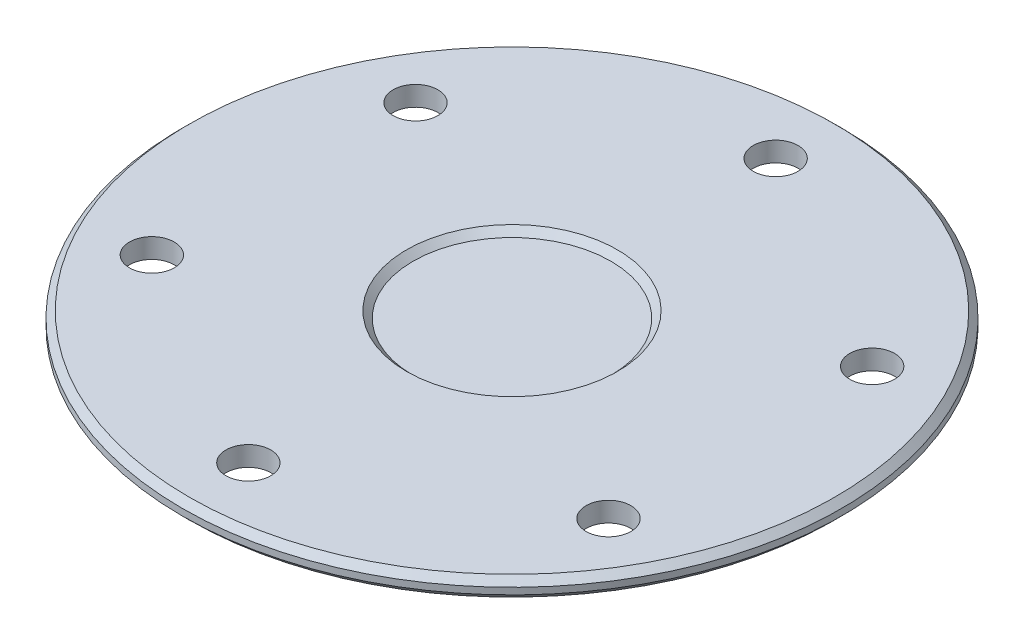
ISO-10303-21;
HEADER;
FILE_DESCRIPTION(('STEP AP214'),'2;1');
FILE_NAME('part.step','',(''),(''),'','','');
FILE_SCHEMA(('AUTOMOTIVE_DESIGN { 1 0 10303 214 1 1 1 1 }'));
ENDSEC;
DATA;
#1=APPLICATION_CONTEXT('core data for automotive mechanical design processes');
#2=APPLICATION_PROTOCOL_DEFINITION('international standard','automotive_design',2000,#1);
#3=PRODUCT_CONTEXT('',#1,'mechanical');
#4=PRODUCT('Part','Part','',(#3));
#5=PRODUCT_RELATED_PRODUCT_CATEGORY('part','',(#4));
#6=PRODUCT_DEFINITION_FORMATION('','',#4);
#7=PRODUCT_DEFINITION_CONTEXT('part definition',#1,'design');
#8=PRODUCT_DEFINITION('design','',#6,#7);
#9=PRODUCT_DEFINITION_SHAPE('','',#8);
#10=(LENGTH_UNIT() NAMED_UNIT(*) SI_UNIT(.MILLI.,.METRE.));
#11=(NAMED_UNIT(*) PLANE_ANGLE_UNIT() SI_UNIT($,.RADIAN.));
#12=(NAMED_UNIT(*) SI_UNIT($,.STERADIAN.) SOLID_ANGLE_UNIT());
#13=UNCERTAINTY_MEASURE_WITH_UNIT(LENGTH_MEASURE(1.E-05),#10,'distance_accuracy_value','');
#14=(GEOMETRIC_REPRESENTATION_CONTEXT(3) GLOBAL_UNCERTAINTY_ASSIGNED_CONTEXT((#13)) GLOBAL_UNIT_ASSIGNED_CONTEXT((#10,
#11,#12)) REPRESENTATION_CONTEXT('',''));
#15=CARTESIAN_POINT('',(0.,0.,0.));
#16=DIRECTION('',(0.,0.,1.));
#17=DIRECTION('',(1.,0.,0.));
#18=AXIS2_PLACEMENT_3D('',#15,#16,#17);
#19=CARTESIAN_POINT('',(0.,3.,0.));
#20=DIRECTION('',(0.,-1.,0.));
#21=DIRECTION('',(0.,0.,-1.));
#22=AXIS2_PLACEMENT_3D('',#19,#20,#21);
#23=CYLINDRICAL_SURFACE('',#22,50.);
#24=CARTESIAN_POINT('',(0.,1.,0.));
#25=DIRECTION('',(0.,1.,0.));
#26=DIRECTION('',(0.,0.,1.));
#27=AXIS2_PLACEMENT_3D('',#24,#25,#26);
#28=CIRCLE('',#27,50.);
#29=CARTESIAN_POINT('',(0.,1.,50.));
#30=VERTEX_POINT('',#29);
#31=EDGE_CURVE('E52',#30,#30,#28,.T.);
#32=ORIENTED_EDGE('',*,*,#31,.T.);
#33=EDGE_LOOP('',(#32));
#34=FACE_BOUND('',#33,.T.);
#35=CARTESIAN_POINT('',(0.,1.99999999999999,0.));
#36=DIRECTION('',(0.,1.,0.));
#37=DIRECTION('',(0.,0.,1.));
#38=AXIS2_PLACEMENT_3D('',#35,#36,#37);
#39=CIRCLE('',#38,50.);
#40=CARTESIAN_POINT('',(0.,1.99999999999999,50.));
#41=VERTEX_POINT('',#40);
#42=EDGE_CURVE('E57',#41,#41,#39,.F.);
#43=ORIENTED_EDGE('',*,*,#42,.T.);
#44=EDGE_LOOP('',(#43));
#45=FACE_BOUND('',#44,.T.);
#46=ADVANCED_FACE('F36',(#34,#45),#23,.T.);
#47=CARTESIAN_POINT('',(0.,3.,0.));
#48=DIRECTION('',(0.,1.,0.));
#49=DIRECTION('',(0.,0.,1.));
#50=AXIS2_PLACEMENT_3D('',#47,#48,#49);
#51=PLANE('',#50);
#52=CARTESIAN_POINT('',(0.,3.,0.));
#53=DIRECTION('',(0.,1.,0.));
#54=DIRECTION('',(0.,0.,1.));
#55=AXIS2_PLACEMENT_3D('',#52,#53,#54);
#56=CIRCLE('',#55,49.);
#57=CARTESIAN_POINT('',(0.,3.,49.));
#58=VERTEX_POINT('',#57);
#59=EDGE_CURVE('E10',#58,#58,#56,.T.);
#60=ORIENTED_EDGE('',*,*,#59,.T.);
#61=EDGE_LOOP('',(#60));
#62=FACE_BOUND('',#61,.T.);
#63=CARTESIAN_POINT('',(0.,3.,0.));
#64=DIRECTION('',(0.,1.,0.));
#65=DIRECTION('',(0.,0.,1.));
#66=AXIS2_PLACEMENT_3D('',#63,#64,#65);
#67=CIRCLE('',#66,16.);
#68=CARTESIAN_POINT('',(0.,3.,16.));
#69=VERTEX_POINT('',#68);
#70=EDGE_CURVE('E44',#69,#69,#67,.F.);
#71=ORIENTED_EDGE('',*,*,#70,.T.);
#72=EDGE_LOOP('',(#71));
#73=FACE_BOUND('',#72,.T.);
#74=CARTESIAN_POINT('',(-34.6410161513773,3.,-20.0000000000004));
#75=DIRECTION('',(0.,1.,0.));
#76=DIRECTION('',(0.866025403784433,0.,0.50000000000001));
#77=AXIS2_PLACEMENT_3D('',#74,#75,#76);
#78=CIRCLE('',#77,3.39999999999999);
#79=CARTESIAN_POINT('',(-31.6965297785103,3.,-18.3000000000004));
#80=VERTEX_POINT('',#79);
#81=EDGE_CURVE('E77',#80,#80,#78,.T.);
#82=ORIENTED_EDGE('',*,*,#81,.F.);
#83=EDGE_LOOP('',(#82));
#84=FACE_BOUND('',#83,.T.);
#85=CARTESIAN_POINT('',(-34.6410161513777,3.,19.9999999999997));
#86=DIRECTION('',(0.,1.,0.));
#87=DIRECTION('',(0.866025403784443,0.,-0.499999999999992));
#88=AXIS2_PLACEMENT_3D('',#85,#86,#87);
#89=CIRCLE('',#88,3.39999999999999);
#90=CARTESIAN_POINT('',(-31.6965297785106,3.,18.2999999999997));
#91=VERTEX_POINT('',#90);
#92=EDGE_CURVE('E76',#91,#91,#89,.T.);
#93=ORIENTED_EDGE('',*,*,#92,.F.);
#94=EDGE_LOOP('',(#93));
#95=FACE_BOUND('',#94,.T.);
#96=CARTESIAN_POINT('',(0.,3.,40.));
#97=DIRECTION('',(0.,1.,0.));
#98=DIRECTION('',(0.,0.,-1.));
#99=AXIS2_PLACEMENT_3D('',#96,#97,#98);
#100=CIRCLE('',#99,3.39999999999999);
#101=CARTESIAN_POINT('',(0.,3.,36.6));
#102=VERTEX_POINT('',#101);
#103=EDGE_CURVE('E84',#102,#102,#100,.T.);
#104=ORIENTED_EDGE('',*,*,#103,.F.);
#105=EDGE_LOOP('',(#104));
#106=FACE_BOUND('',#105,.T.);
#107=CARTESIAN_POINT('',(34.6410161513775,3.,20.0000000000002));
#108=DIRECTION('',(0.,1.,0.));
#109=DIRECTION('',(-0.866025403784436,0.,-0.500000000000004));
#110=AXIS2_PLACEMENT_3D('',#107,#108,#109);
#111=CIRCLE('',#110,3.39999999999999);
#112=CARTESIAN_POINT('',(31.6965297785104,3.,18.3000000000002));
#113=VERTEX_POINT('',#112);
#114=EDGE_CURVE('E90',#113,#113,#111,.T.);
#115=ORIENTED_EDGE('',*,*,#114,.F.);
#116=EDGE_LOOP('',(#115));
#117=FACE_BOUND('',#116,.T.);
#118=CARTESIAN_POINT('',(34.6410161513776,3.,-19.9999999999999));
#119=DIRECTION('',(0.,1.,0.));
#120=DIRECTION('',(-0.86602540378444,0.,0.499999999999998));
#121=AXIS2_PLACEMENT_3D('',#118,#119,#120);
#122=CIRCLE('',#121,3.39999999999999);
#123=CARTESIAN_POINT('',(31.6965297785105,3.,-18.2999999999999));
#124=VERTEX_POINT('',#123);
#125=EDGE_CURVE('E69',#124,#124,#122,.T.);
#126=ORIENTED_EDGE('',*,*,#125,.F.);
#127=EDGE_LOOP('',(#126));
#128=FACE_BOUND('',#127,.T.);
#129=CARTESIAN_POINT('',(0.,3.,-40.));
#130=DIRECTION('',(0.,1.,0.));
#131=DIRECTION('',(0.,0.,1.));
#132=AXIS2_PLACEMENT_3D('',#129,#130,#131);
#133=CIRCLE('',#132,3.39999999999999);
#134=CARTESIAN_POINT('',(0.,3.,-36.6));
#135=VERTEX_POINT('',#134);
#136=EDGE_CURVE('E63',#135,#135,#133,.T.);
#137=ORIENTED_EDGE('',*,*,#136,.F.);
#138=EDGE_LOOP('',(#137));
#139=FACE_BOUND('',#138,.T.);
#140=ADVANCED_FACE('F111',(#62,#73,#84,#95,#106,#117,#128,#139),#51,.T.);
#141=CARTESIAN_POINT('',(0.,0.,0.));
#142=DIRECTION('',(0.,1.,0.));
#143=DIRECTION('',(0.,0.,1.));
#144=AXIS2_PLACEMENT_3D('',#141,#142,#143);
#145=PLANE('',#144);
#146=CARTESIAN_POINT('',(0.,0.,0.));
#147=DIRECTION('',(0.,1.,0.));
#148=DIRECTION('',(0.,0.,1.));
#149=AXIS2_PLACEMENT_3D('',#146,#147,#148);
#150=CIRCLE('',#149,49.);
#151=CARTESIAN_POINT('',(0.,0.,49.));
#152=VERTEX_POINT('',#151);
#153=EDGE_CURVE('E48',#152,#152,#150,.F.);
#154=ORIENTED_EDGE('',*,*,#153,.T.);
#155=EDGE_LOOP('',(#154));
#156=FACE_BOUND('',#155,.T.);
#157=CARTESIAN_POINT('',(-34.6410161513773,0.,-20.0000000000004));
#158=DIRECTION('',(0.,1.,0.));
#159=DIRECTION('',(0.866025403784433,0.,0.50000000000001));
#160=AXIS2_PLACEMENT_3D('',#157,#158,#159);
#161=CIRCLE('',#160,3.39999999999999);
#162=CARTESIAN_POINT('',(-31.6965297785103,0.,-18.3000000000004));
#163=VERTEX_POINT('',#162);
#164=EDGE_CURVE('E73',#163,#163,#161,.T.);
#165=ORIENTED_EDGE('',*,*,#164,.T.);
#166=EDGE_LOOP('',(#165));
#167=FACE_BOUND('',#166,.T.);
#168=CARTESIAN_POINT('',(-34.6410161513777,0.,19.9999999999997));
#169=DIRECTION('',(0.,1.,0.));
#170=DIRECTION('',(0.866025403784443,0.,-0.499999999999992));
#171=AXIS2_PLACEMENT_3D('',#168,#169,#170);
#172=CIRCLE('',#171,3.39999999999999);
#173=CARTESIAN_POINT('',(-31.6965297785106,0.,18.2999999999997));
#174=VERTEX_POINT('',#173);
#175=EDGE_CURVE('E81',#174,#174,#172,.T.);
#176=ORIENTED_EDGE('',*,*,#175,.T.);
#177=EDGE_LOOP('',(#176));
#178=FACE_BOUND('',#177,.T.);
#179=CARTESIAN_POINT('',(0.,0.,40.));
#180=DIRECTION('',(0.,1.,0.));
#181=DIRECTION('',(0.,0.,-1.));
#182=AXIS2_PLACEMENT_3D('',#179,#180,#181);
#183=CIRCLE('',#182,3.39999999999999);
#184=CARTESIAN_POINT('',(0.,0.,36.6));
#185=VERTEX_POINT('',#184);
#186=EDGE_CURVE('E87',#185,#185,#183,.T.);
#187=ORIENTED_EDGE('',*,*,#186,.T.);
#188=EDGE_LOOP('',(#187));
#189=FACE_BOUND('',#188,.T.);
#190=CARTESIAN_POINT('',(34.6410161513775,0.,20.0000000000002));
#191=DIRECTION('',(0.,1.,0.));
#192=DIRECTION('',(-0.866025403784436,0.,-0.500000000000004));
#193=AXIS2_PLACEMENT_3D('',#190,#191,#192);
#194=CIRCLE('',#193,3.39999999999999);
#195=CARTESIAN_POINT('',(31.6965297785104,0.,18.3000000000002));
#196=VERTEX_POINT('',#195);
#197=EDGE_CURVE('E72',#196,#196,#194,.T.);
#198=ORIENTED_EDGE('',*,*,#197,.T.);
#199=EDGE_LOOP('',(#198));
#200=FACE_BOUND('',#199,.T.);
#201=CARTESIAN_POINT('',(34.6410161513776,0.,-19.9999999999999));
#202=DIRECTION('',(0.,1.,0.));
#203=DIRECTION('',(-0.86602540378444,0.,0.499999999999998));
#204=AXIS2_PLACEMENT_3D('',#201,#202,#203);
#205=CIRCLE('',#204,3.39999999999999);
#206=CARTESIAN_POINT('',(31.6965297785105,0.,-18.2999999999999));
#207=VERTEX_POINT('',#206);
#208=EDGE_CURVE('E66',#207,#207,#205,.T.);
#209=ORIENTED_EDGE('',*,*,#208,.T.);
#210=EDGE_LOOP('',(#209));
#211=FACE_BOUND('',#210,.T.);
#212=CARTESIAN_POINT('',(0.,0.,-40.));
#213=DIRECTION('',(0.,1.,0.));
#214=DIRECTION('',(0.,0.,1.));
#215=AXIS2_PLACEMENT_3D('',#212,#213,#214);
#216=CIRCLE('',#215,3.39999999999999);
#217=CARTESIAN_POINT('',(0.,0.,-36.6));
#218=VERTEX_POINT('',#217);
#219=EDGE_CURVE('E60',#218,#218,#216,.T.);
#220=ORIENTED_EDGE('',*,*,#219,.T.);
#221=EDGE_LOOP('',(#220));
#222=FACE_BOUND('',#221,.T.);
#223=ADVANCED_FACE('F117',(#156,#167,#178,#189,#200,#211,#222),#145,.F.);
#224=CARTESIAN_POINT('',(0.,3.,-40.));
#225=DIRECTION('',(0.,1.,0.));
#226=DIRECTION('',(0.,0.,1.));
#227=AXIS2_PLACEMENT_3D('',#224,#225,#226);
#228=CYLINDRICAL_SURFACE('',#227,3.39999999999999);
#229=ORIENTED_EDGE('',*,*,#136,.T.);
#230=EDGE_LOOP('',(#229));
#231=FACE_BOUND('',#230,.T.);
#232=ORIENTED_EDGE('',*,*,#219,.F.);
#233=EDGE_LOOP('',(#232));
#234=FACE_BOUND('',#233,.T.);
#235=ADVANCED_FACE('F143',(#231,#234),#228,.F.);
#236=CARTESIAN_POINT('',(34.6410161513776,3.,-19.9999999999999));
#237=DIRECTION('',(0.,1.,0.));
#238=DIRECTION('',(-0.86602540378444,0.,0.499999999999998));
#239=AXIS2_PLACEMENT_3D('',#236,#237,#238);
#240=CYLINDRICAL_SURFACE('',#239,3.39999999999999);
#241=ORIENTED_EDGE('',*,*,#125,.T.);
#242=EDGE_LOOP('',(#241));
#243=FACE_BOUND('',#242,.T.);
#244=ORIENTED_EDGE('',*,*,#208,.F.);
#245=EDGE_LOOP('',(#244));
#246=FACE_BOUND('',#245,.T.);
#247=ADVANCED_FACE('F157',(#243,#246),#240,.F.);
#248=CARTESIAN_POINT('',(34.6410161513775,3.,20.0000000000002));
#249=DIRECTION('',(0.,1.,0.));
#250=DIRECTION('',(-0.866025403784436,0.,-0.500000000000004));
#251=AXIS2_PLACEMENT_3D('',#248,#249,#250);
#252=CYLINDRICAL_SURFACE('',#251,3.39999999999999);
#253=ORIENTED_EDGE('',*,*,#114,.T.);
#254=EDGE_LOOP('',(#253));
#255=FACE_BOUND('',#254,.T.);
#256=ORIENTED_EDGE('',*,*,#197,.F.);
#257=EDGE_LOOP('',(#256));
#258=FACE_BOUND('',#257,.T.);
#259=ADVANCED_FACE('F163',(#255,#258),#252,.F.);
#260=CARTESIAN_POINT('',(0.,3.,40.));
#261=DIRECTION('',(0.,1.,0.));
#262=DIRECTION('',(0.,0.,-1.));
#263=AXIS2_PLACEMENT_3D('',#260,#261,#262);
#264=CYLINDRICAL_SURFACE('',#263,3.39999999999999);
#265=ORIENTED_EDGE('',*,*,#103,.T.);
#266=EDGE_LOOP('',(#265));
#267=FACE_BOUND('',#266,.T.);
#268=ORIENTED_EDGE('',*,*,#186,.F.);
#269=EDGE_LOOP('',(#268));
#270=FACE_BOUND('',#269,.T.);
#271=ADVANCED_FACE('F173',(#267,#270),#264,.F.);
#272=CARTESIAN_POINT('',(-34.6410161513777,3.,19.9999999999997));
#273=DIRECTION('',(0.,1.,0.));
#274=DIRECTION('',(0.866025403784443,0.,-0.499999999999992));
#275=AXIS2_PLACEMENT_3D('',#272,#273,#274);
#276=CYLINDRICAL_SURFACE('',#275,3.39999999999999);
#277=ORIENTED_EDGE('',*,*,#92,.T.);
#278=EDGE_LOOP('',(#277));
#279=FACE_BOUND('',#278,.T.);
#280=ORIENTED_EDGE('',*,*,#175,.F.);
#281=EDGE_LOOP('',(#280));
#282=FACE_BOUND('',#281,.T.);
#283=ADVANCED_FACE('F169',(#279,#282),#276,.F.);
#284=CARTESIAN_POINT('',(-34.6410161513773,3.,-20.0000000000004));
#285=DIRECTION('',(0.,1.,0.));
#286=DIRECTION('',(0.866025403784433,0.,0.50000000000001));
#287=AXIS2_PLACEMENT_3D('',#284,#285,#286);
#288=CYLINDRICAL_SURFACE('',#287,3.39999999999999);
#289=ORIENTED_EDGE('',*,*,#81,.T.);
#290=EDGE_LOOP('',(#289));
#291=FACE_BOUND('',#290,.T.);
#292=ORIENTED_EDGE('',*,*,#164,.F.);
#293=EDGE_LOOP('',(#292));
#294=FACE_BOUND('',#293,.T.);
#295=ADVANCED_FACE('F135',(#291,#294),#288,.F.);
#296=CARTESIAN_POINT('',(0.,2.,0.));
#297=DIRECTION('',(0.,1.,0.));
#298=DIRECTION('',(0.,0.,1.));
#299=AXIS2_PLACEMENT_3D('',#296,#297,#298);
#300=PLANE('',#299);
#301=CARTESIAN_POINT('',(0.,2.,0.));
#302=DIRECTION('',(0.,1.,0.));
#303=DIRECTION('',(0.,0.,1.));
#304=AXIS2_PLACEMENT_3D('',#301,#302,#303);
#305=CIRCLE('',#304,15.);
#306=CARTESIAN_POINT('',(0.,2.,15.));
#307=VERTEX_POINT('',#306);
#308=EDGE_CURVE('E80',#307,#307,#305,.T.);
#309=ORIENTED_EDGE('',*,*,#308,.T.);
#310=EDGE_LOOP('',(#309));
#311=FACE_BOUND('',#310,.T.);
#312=ADVANCED_FACE('F100',(#311),#300,.T.);
#313=CARTESIAN_POINT('',(0.,1.,0.));
#314=DIRECTION('',(0.,1.,0.));
#315=DIRECTION('',(0.,0.,1.));
#316=AXIS2_PLACEMENT_3D('',#313,#314,#315);
#317=CONICAL_SURFACE('',#316,50.,0.785398163397452);
#318=ORIENTED_EDGE('',*,*,#153,.F.);
#319=EDGE_LOOP('',(#318));
#320=FACE_BOUND('',#319,.T.);
#321=ORIENTED_EDGE('',*,*,#31,.F.);
#322=EDGE_LOOP('',(#321));
#323=FACE_BOUND('',#322,.T.);
#324=ADVANCED_FACE('F108',(#320,#323),#317,.T.);
#325=CARTESIAN_POINT('',(0.,3.,0.));
#326=DIRECTION('',(0.,-1.,0.));
#327=DIRECTION('',(0.,0.,-1.));
#328=AXIS2_PLACEMENT_3D('',#325,#326,#327);
#329=CONICAL_SURFACE('',#328,49.,0.785398163397438);
#330=ORIENTED_EDGE('',*,*,#42,.F.);
#331=EDGE_LOOP('',(#330));
#332=FACE_BOUND('',#331,.T.);
#333=ORIENTED_EDGE('',*,*,#59,.F.);
#334=EDGE_LOOP('',(#333));
#335=FACE_BOUND('',#334,.T.);
#336=ADVANCED_FACE('F103',(#332,#335),#329,.T.);
#337=CARTESIAN_POINT('',(0.,1.99999999999999,0.));
#338=DIRECTION('',(0.,1.,0.));
#339=DIRECTION('',(0.,0.,1.));
#340=AXIS2_PLACEMENT_3D('',#337,#338,#339);
#341=CONICAL_SURFACE('',#340,15.,0.785398163397449);
#342=ORIENTED_EDGE('',*,*,#70,.F.);
#343=EDGE_LOOP('',(#342));
#344=FACE_BOUND('',#343,.T.);
#345=ORIENTED_EDGE('',*,*,#308,.F.);
#346=EDGE_LOOP('',(#345));
#347=FACE_BOUND('',#346,.T.);
#348=ADVANCED_FACE('F39',(#344,#347),#341,.F.);
#349=CLOSED_SHELL('',(#46,#140,#223,#235,#247,#259,#271,#283,#295,#312,#324,#336,#348));
#350=MANIFOLD_SOLID_BREP('B2',#349);
#351=ADVANCED_BREP_SHAPE_REPRESENTATION('',(#18,#350),#14);
#352=SHAPE_DEFINITION_REPRESENTATION(#9,#351);
ENDSEC;
END-ISO-10303-21;
